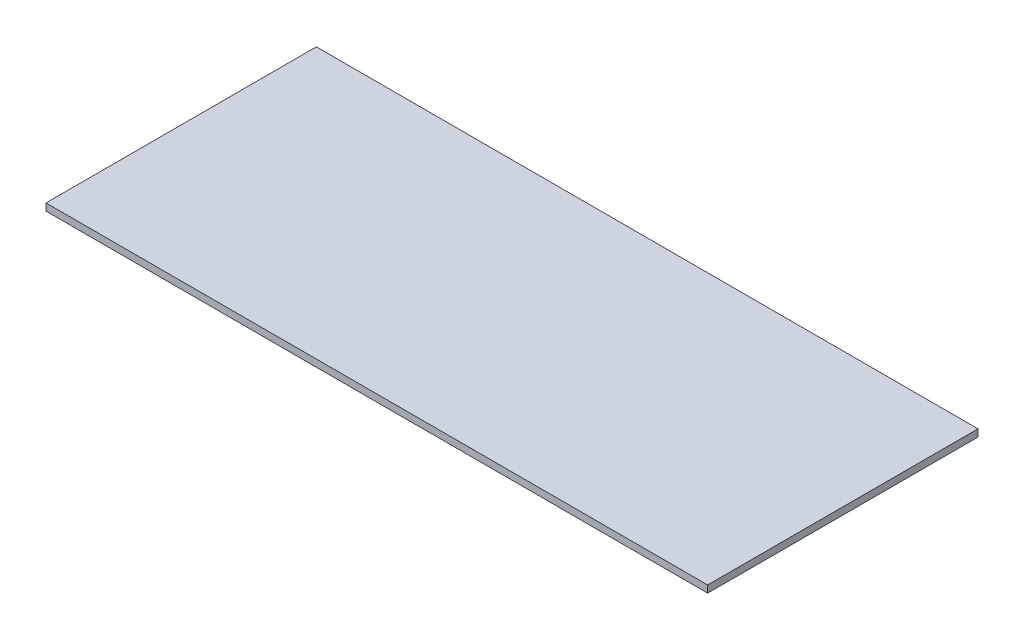
ISO-10303-21;
HEADER;
FILE_DESCRIPTION(('STEP AP214'),'2;1');
FILE_NAME('part.step','',(''),(''),'','','');
FILE_SCHEMA(('AUTOMOTIVE_DESIGN { 1 0 10303 214 1 1 1 1 }'));
ENDSEC;
DATA;
#1=APPLICATION_CONTEXT('core data for automotive mechanical design processes');
#2=APPLICATION_PROTOCOL_DEFINITION('international standard','automotive_design',2000,#1);
#3=PRODUCT_CONTEXT('',#1,'mechanical');
#4=PRODUCT('Part','Part','',(#3));
#5=PRODUCT_RELATED_PRODUCT_CATEGORY('part','',(#4));
#6=PRODUCT_DEFINITION_FORMATION('','',#4);
#7=PRODUCT_DEFINITION_CONTEXT('part definition',#1,'design');
#8=PRODUCT_DEFINITION('design','',#6,#7);
#9=PRODUCT_DEFINITION_SHAPE('','',#8);
#10=(LENGTH_UNIT() NAMED_UNIT(*) SI_UNIT(.MILLI.,.METRE.));
#11=(NAMED_UNIT(*) PLANE_ANGLE_UNIT() SI_UNIT($,.RADIAN.));
#12=(NAMED_UNIT(*) SI_UNIT($,.STERADIAN.) SOLID_ANGLE_UNIT());
#13=UNCERTAINTY_MEASURE_WITH_UNIT(LENGTH_MEASURE(1.E-05),#10,'distance_accuracy_value','');
#14=(GEOMETRIC_REPRESENTATION_CONTEXT(3) GLOBAL_UNCERTAINTY_ASSIGNED_CONTEXT((#13)) GLOBAL_UNIT_ASSIGNED_CONTEXT((#10,
#11,#12)) REPRESENTATION_CONTEXT('',''));
#15=CARTESIAN_POINT('',(0.,0.,0.));
#16=DIRECTION('',(0.,0.,1.));
#17=DIRECTION('',(1.,0.,0.));
#18=AXIS2_PLACEMENT_3D('',#15,#16,#17);
#19=CARTESIAN_POINT('',(-75.8893216917582,1.27,-18.2309472113738));
#20=DIRECTION('',(1.,0.,0.));
#21=DIRECTION('',(0.,0.,-1.));
#22=AXIS2_PLACEMENT_3D('',#19,#20,#21);
#23=PLANE('',#22);
#24=DIRECTION('',(0.,0.,1.));
#25=VECTOR('',#24,1.);
#26=CARTESIAN_POINT('',(-75.8893216917582,0.,-18.2309472113738));
#27=LINE('',#26,#25);
#28=CARTESIAN_POINT('',(-75.8893216917582,0.,-18.2309472113738));
#29=VERTEX_POINT('',#28);
#30=CARTESIAN_POINT('',(-75.8893216917582,0.,30.0290527886262));
#31=VERTEX_POINT('',#30);
#32=EDGE_CURVE('E96',#29,#31,#27,.T.);
#33=ORIENTED_EDGE('',*,*,#32,.T.);
#34=DIRECTION('',(0.,-1.,0.));
#35=VECTOR('',#34,1.);
#36=CARTESIAN_POINT('',(-75.8893216917582,1.27,30.0290527886262));
#37=LINE('',#36,#35);
#38=CARTESIAN_POINT('',(-75.8893216917582,1.27,30.0290527886262));
#39=VERTEX_POINT('',#38);
#40=EDGE_CURVE('E11',#39,#31,#37,.T.);
#41=ORIENTED_EDGE('',*,*,#40,.F.);
#42=DIRECTION('',(0.,0.,1.));
#43=VECTOR('',#42,1.);
#44=CARTESIAN_POINT('',(-75.8893216917582,1.27,-18.2309472113738));
#45=LINE('',#44,#43);
#46=CARTESIAN_POINT('',(-75.8893216917582,1.27,-18.2309472113738));
#47=VERTEX_POINT('',#46);
#48=EDGE_CURVE('E84',#47,#39,#45,.T.);
#49=ORIENTED_EDGE('',*,*,#48,.F.);
#50=DIRECTION('',(0.,-1.,0.));
#51=VECTOR('',#50,1.);
#52=CARTESIAN_POINT('',(-75.8893216917582,1.27,-18.2309472113738));
#53=LINE('',#52,#51);
#54=EDGE_CURVE('E92',#47,#29,#53,.T.);
#55=ORIENTED_EDGE('',*,*,#54,.T.);
#56=EDGE_LOOP('',(#33,#41,#49,#55));
#57=FACE_BOUND('',#56,.T.);
#58=ADVANCED_FACE('F33',(#57),#23,.F.);
#59=CARTESIAN_POINT('',(-75.8893216917582,1.27,30.0290527886262));
#60=DIRECTION('',(0.,0.,-1.));
#61=DIRECTION('',(-1.,0.,0.));
#62=AXIS2_PLACEMENT_3D('',#59,#60,#61);
#63=PLANE('',#62);
#64=DIRECTION('',(1.,0.,0.));
#65=VECTOR('',#64,1.);
#66=CARTESIAN_POINT('',(-75.8893216917582,0.,30.0290527886262));
#67=LINE('',#66,#65);
#68=CARTESIAN_POINT('',(42.2206783082418,0.,30.0290527886262));
#69=VERTEX_POINT('',#68);
#70=EDGE_CURVE('E88',#31,#69,#67,.T.);
#71=ORIENTED_EDGE('',*,*,#70,.T.);
#72=DIRECTION('',(0.,-1.,0.));
#73=VECTOR('',#72,1.);
#74=CARTESIAN_POINT('',(42.2206783082418,1.27,30.0290527886262));
#75=LINE('',#74,#73);
#76=CARTESIAN_POINT('',(42.2206783082418,1.27,30.0290527886262));
#77=VERTEX_POINT('',#76);
#78=EDGE_CURVE('E41',#77,#69,#75,.T.);
#79=ORIENTED_EDGE('',*,*,#78,.F.);
#80=DIRECTION('',(1.,0.,0.));
#81=VECTOR('',#80,1.);
#82=CARTESIAN_POINT('',(-75.8893216917582,1.27,30.0290527886262));
#83=LINE('',#82,#81);
#84=EDGE_CURVE('E79',#39,#77,#83,.T.);
#85=ORIENTED_EDGE('',*,*,#84,.F.);
#86=ORIENTED_EDGE('',*,*,#40,.T.);
#87=EDGE_LOOP('',(#71,#79,#85,#86));
#88=FACE_BOUND('',#87,.T.);
#89=ADVANCED_FACE('F87',(#88),#63,.F.);
#90=CARTESIAN_POINT('',(42.2206783082418,1.27,-18.2309472113738));
#91=DIRECTION('',(-1.,0.,0.));
#92=DIRECTION('',(0.,0.,1.));
#93=AXIS2_PLACEMENT_3D('',#90,#91,#92);
#94=PLANE('',#93);
#95=DIRECTION('',(0.,0.,-1.));
#96=VECTOR('',#95,1.);
#97=CARTESIAN_POINT('',(42.2206783082418,0.,-18.2309472113738));
#98=LINE('',#97,#96);
#99=CARTESIAN_POINT('',(42.2206783082418,0.,-18.2309472113738));
#100=VERTEX_POINT('',#99);
#101=EDGE_CURVE('E66',#69,#100,#98,.T.);
#102=ORIENTED_EDGE('',*,*,#101,.T.);
#103=DIRECTION('',(0.,-1.,0.));
#104=VECTOR('',#103,1.);
#105=CARTESIAN_POINT('',(42.2206783082418,1.27,-18.2309472113738));
#106=LINE('',#105,#104);
#107=CARTESIAN_POINT('',(42.2206783082418,1.27,-18.2309472113738));
#108=VERTEX_POINT('',#107);
#109=EDGE_CURVE('E89',#108,#100,#106,.T.);
#110=ORIENTED_EDGE('',*,*,#109,.F.);
#111=DIRECTION('',(0.,0.,-1.));
#112=VECTOR('',#111,1.);
#113=CARTESIAN_POINT('',(42.2206783082418,1.27,-18.2309472113738));
#114=LINE('',#113,#112);
#115=EDGE_CURVE('E82',#77,#108,#114,.T.);
#116=ORIENTED_EDGE('',*,*,#115,.F.);
#117=ORIENTED_EDGE('',*,*,#78,.T.);
#118=EDGE_LOOP('',(#102,#110,#116,#117));
#119=FACE_BOUND('',#118,.T.);
#120=ADVANCED_FACE('F90',(#119),#94,.F.);
#121=CARTESIAN_POINT('',(-75.8893216917582,1.27,-18.2309472113738));
#122=DIRECTION('',(0.,0.,1.));
#123=DIRECTION('',(1.,0.,0.));
#124=AXIS2_PLACEMENT_3D('',#121,#122,#123);
#125=PLANE('',#124);
#126=DIRECTION('',(-1.,0.,0.));
#127=VECTOR('',#126,1.);
#128=CARTESIAN_POINT('',(-75.8893216917582,0.,-18.2309472113738));
#129=LINE('',#128,#127);
#130=EDGE_CURVE('E72',#100,#29,#129,.T.);
#131=ORIENTED_EDGE('',*,*,#130,.T.);
#132=ORIENTED_EDGE('',*,*,#54,.F.);
#133=DIRECTION('',(-1.,0.,0.));
#134=VECTOR('',#133,1.);
#135=CARTESIAN_POINT('',(-75.8893216917582,1.27,-18.2309472113738));
#136=LINE('',#135,#134);
#137=EDGE_CURVE('E49',#108,#47,#136,.T.);
#138=ORIENTED_EDGE('',*,*,#137,.F.);
#139=ORIENTED_EDGE('',*,*,#109,.T.);
#140=EDGE_LOOP('',(#131,#132,#138,#139));
#141=FACE_BOUND('',#140,.T.);
#142=ADVANCED_FACE('F103',(#141),#125,.F.);
#143=CARTESIAN_POINT('',(0.,1.27,0.));
#144=DIRECTION('',(0.,1.,0.));
#145=DIRECTION('',(0.,0.,1.));
#146=AXIS2_PLACEMENT_3D('',#143,#144,#145);
#147=PLANE('',#146);
#148=ORIENTED_EDGE('',*,*,#48,.T.);
#149=ORIENTED_EDGE('',*,*,#84,.T.);
#150=ORIENTED_EDGE('',*,*,#115,.T.);
#151=ORIENTED_EDGE('',*,*,#137,.T.);
#152=EDGE_LOOP('',(#148,#149,#150,#151));
#153=FACE_BOUND('',#152,.T.);
#154=ADVANCED_FACE('F80',(#153),#147,.T.);
#155=CARTESIAN_POINT('',(0.,0.,0.));
#156=DIRECTION('',(0.,1.,0.));
#157=DIRECTION('',(0.,0.,1.));
#158=AXIS2_PLACEMENT_3D('',#155,#156,#157);
#159=PLANE('',#158);
#160=ORIENTED_EDGE('',*,*,#32,.F.);
#161=ORIENTED_EDGE('',*,*,#130,.F.);
#162=ORIENTED_EDGE('',*,*,#101,.F.);
#163=ORIENTED_EDGE('',*,*,#70,.F.);
#164=EDGE_LOOP('',(#160,#161,#162,#163));
#165=FACE_BOUND('',#164,.T.);
#166=ADVANCED_FACE('F106',(#165),#159,.F.);
#167=CLOSED_SHELL('',(#58,#89,#120,#142,#154,#166));
#168=MANIFOLD_SOLID_BREP('B2',#167);
#169=ADVANCED_BREP_SHAPE_REPRESENTATION('',(#18,#168),#14);
#170=SHAPE_DEFINITION_REPRESENTATION(#9,#169);
ENDSEC;
END-ISO-10303-21;
